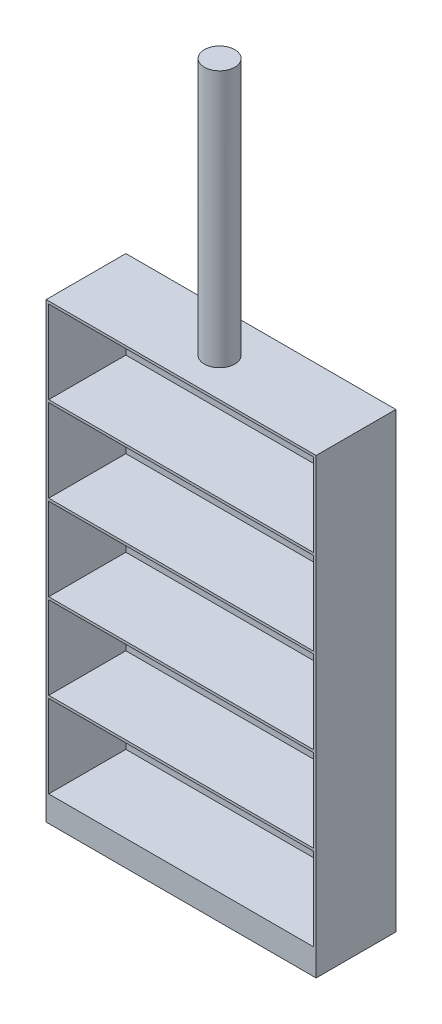
ISO-10303-21;
HEADER;
FILE_DESCRIPTION(('STEP AP214'),'2;1');
FILE_NAME('part.step','',(''),(''),'','','');
FILE_SCHEMA(('AUTOMOTIVE_DESIGN { 1 0 10303 214 1 1 1 1 }'));
ENDSEC;
DATA;
#1=APPLICATION_CONTEXT('core data for automotive mechanical design processes');
#2=APPLICATION_PROTOCOL_DEFINITION('international standard','automotive_design',2000,#1);
#3=PRODUCT_CONTEXT('',#1,'mechanical');
#4=PRODUCT('Part','Part','',(#3));
#5=PRODUCT_RELATED_PRODUCT_CATEGORY('part','',(#4));
#6=PRODUCT_DEFINITION_FORMATION('','',#4);
#7=PRODUCT_DEFINITION_CONTEXT('part definition',#1,'design');
#8=PRODUCT_DEFINITION('design','',#6,#7);
#9=PRODUCT_DEFINITION_SHAPE('','',#8);
#10=(LENGTH_UNIT() NAMED_UNIT(*) SI_UNIT(.MILLI.,.METRE.));
#11=(NAMED_UNIT(*) PLANE_ANGLE_UNIT() SI_UNIT($,.RADIAN.));
#12=(NAMED_UNIT(*) SI_UNIT($,.STERADIAN.) SOLID_ANGLE_UNIT());
#13=UNCERTAINTY_MEASURE_WITH_UNIT(LENGTH_MEASURE(1.E-05),#10,'distance_accuracy_value','');
#14=(GEOMETRIC_REPRESENTATION_CONTEXT(3) GLOBAL_UNCERTAINTY_ASSIGNED_CONTEXT((#13)) GLOBAL_UNIT_ASSIGNED_CONTEXT((#10,
#11,#12)) REPRESENTATION_CONTEXT('',''));
#15=CARTESIAN_POINT('',(0.,0.,0.));
#16=DIRECTION('',(0.,0.,1.));
#17=DIRECTION('',(1.,0.,0.));
#18=AXIS2_PLACEMENT_3D('',#15,#16,#17);
#19=CARTESIAN_POINT('',(-525.,880.,10.));
#20=DIRECTION('',(0.,-1.,0.));
#21=DIRECTION('',(0.,0.,-1.));
#22=AXIS2_PLACEMENT_3D('',#19,#20,#21);
#23=PLANE('',#22);
#24=DIRECTION('',(-1.,0.,0.));
#25=VECTOR('',#24,1.);
#26=CARTESIAN_POINT('',(-525.,880.,0.));
#27=LINE('',#26,#25);
#28=CARTESIAN_POINT('',(525.,880.,0.));
#29=VERTEX_POINT('',#28);
#30=CARTESIAN_POINT('',(-525.,880.,0.));
#31=VERTEX_POINT('',#30);
#32=EDGE_CURVE('E373',#29,#31,#27,.T.);
#33=ORIENTED_EDGE('',*,*,#32,.T.);
#34=DIRECTION('',(0.,0.,-1.));
#35=VECTOR('',#34,1.);
#36=CARTESIAN_POINT('',(-525.,880.,10.));
#37=LINE('',#36,#35);
#38=CARTESIAN_POINT('',(-525.,880.,310.));
#39=VERTEX_POINT('',#38);
#40=EDGE_CURVE('E385',#39,#31,#37,.T.);
#41=ORIENTED_EDGE('',*,*,#40,.F.);
#42=DIRECTION('',(-1.,0.,0.));
#43=VECTOR('',#42,1.);
#44=CARTESIAN_POINT('',(-525.,880.,310.));
#45=LINE('',#44,#43);
#46=CARTESIAN_POINT('',(525.,880.,310.));
#47=VERTEX_POINT('',#46);
#48=EDGE_CURVE('E358',#47,#39,#45,.T.);
#49=ORIENTED_EDGE('',*,*,#48,.F.);
#50=DIRECTION('',(0.,0.,-1.));
#51=VECTOR('',#50,1.);
#52=CARTESIAN_POINT('',(525.,880.,10.));
#53=LINE('',#52,#51);
#54=EDGE_CURVE('E41',#47,#29,#53,.T.);
#55=ORIENTED_EDGE('',*,*,#54,.T.);
#56=EDGE_LOOP('',(#33,#41,#49,#55));
#57=FACE_BOUND('',#56,.T.);
#58=CARTESIAN_POINT('',(0.,880.,160.462668290165));
#59=DIRECTION('',(0.,-1.,0.));
#60=DIRECTION('',(0.,0.,-1.));
#61=AXIS2_PLACEMENT_3D('',#58,#59,#60);
#62=CIRCLE('',#61,59.2219947177455);
#63=CARTESIAN_POINT('',(0.,880.,101.24067357242));
#64=VERTEX_POINT('',#63);
#65=EDGE_CURVE('E11',#64,#64,#62,.F.);
#66=ORIENTED_EDGE('',*,*,#65,.F.);
#67=EDGE_LOOP('',(#66));
#68=FACE_BOUND('',#67,.T.);
#69=ADVANCED_FACE('F33',(#57,#68),#23,.F.);
#70=CARTESIAN_POINT('',(525.,-880.,10.));
#71=DIRECTION('',(-1.,0.,0.));
#72=DIRECTION('',(0.,0.,1.));
#73=AXIS2_PLACEMENT_3D('',#70,#71,#72);
#74=PLANE('',#73);
#75=DIRECTION('',(0.,1.,0.));
#76=VECTOR('',#75,1.);
#77=CARTESIAN_POINT('',(525.,-880.,0.));
#78=LINE('',#77,#76);
#79=CARTESIAN_POINT('',(525.,-880.,0.));
#80=VERTEX_POINT('',#79);
#81=EDGE_CURVE('E370',#80,#29,#78,.T.);
#82=ORIENTED_EDGE('',*,*,#81,.T.);
#83=ORIENTED_EDGE('',*,*,#54,.F.);
#84=DIRECTION('',(0.,1.,0.));
#85=VECTOR('',#84,1.);
#86=CARTESIAN_POINT('',(525.,880.,310.));
#87=LINE('',#86,#85);
#88=CARTESIAN_POINT('',(525.,-880.,310.));
#89=VERTEX_POINT('',#88);
#90=EDGE_CURVE('E367',#89,#47,#87,.T.);
#91=ORIENTED_EDGE('',*,*,#90,.F.);
#92=DIRECTION('',(0.,0.,-1.));
#93=VECTOR('',#92,1.);
#94=CARTESIAN_POINT('',(525.,-880.,10.));
#95=LINE('',#94,#93);
#96=EDGE_CURVE('E379',#89,#80,#95,.T.);
#97=ORIENTED_EDGE('',*,*,#96,.T.);
#98=EDGE_LOOP('',(#82,#83,#91,#97));
#99=FACE_BOUND('',#98,.T.);
#100=ADVANCED_FACE('F35',(#99),#74,.F.);
#101=CARTESIAN_POINT('',(-525.,-880.,10.));
#102=DIRECTION('',(1.,0.,0.));
#103=DIRECTION('',(0.,0.,-1.));
#104=AXIS2_PLACEMENT_3D('',#101,#102,#103);
#105=PLANE('',#104);
#106=DIRECTION('',(0.,-1.,0.));
#107=VECTOR('',#106,1.);
#108=CARTESIAN_POINT('',(-525.,-880.,0.));
#109=LINE('',#108,#107);
#110=CARTESIAN_POINT('',(-525.,-880.,0.));
#111=VERTEX_POINT('',#110);
#112=EDGE_CURVE('E375',#31,#111,#109,.T.);
#113=ORIENTED_EDGE('',*,*,#112,.T.);
#114=DIRECTION('',(0.,0.,-1.));
#115=VECTOR('',#114,1.);
#116=CARTESIAN_POINT('',(-525.,-880.,10.));
#117=LINE('',#116,#115);
#118=CARTESIAN_POINT('',(-525.,-880.,310.));
#119=VERTEX_POINT('',#118);
#120=EDGE_CURVE('E382',#119,#111,#117,.T.);
#121=ORIENTED_EDGE('',*,*,#120,.F.);
#122=DIRECTION('',(0.,-1.,0.));
#123=VECTOR('',#122,1.);
#124=CARTESIAN_POINT('',(-525.,-880.,310.));
#125=LINE('',#124,#123);
#126=EDGE_CURVE('E361',#39,#119,#125,.T.);
#127=ORIENTED_EDGE('',*,*,#126,.F.);
#128=ORIENTED_EDGE('',*,*,#40,.T.);
#129=EDGE_LOOP('',(#113,#121,#127,#128));
#130=FACE_BOUND('',#129,.T.);
#131=ADVANCED_FACE('F399',(#130),#105,.F.);
#132=CARTESIAN_POINT('',(-525.,-880.,10.));
#133=DIRECTION('',(0.,1.,0.));
#134=DIRECTION('',(0.,0.,1.));
#135=AXIS2_PLACEMENT_3D('',#132,#133,#134);
#136=PLANE('',#135);
#137=DIRECTION('',(1.,0.,0.));
#138=VECTOR('',#137,1.);
#139=CARTESIAN_POINT('',(-525.,-880.,0.));
#140=LINE('',#139,#138);
#141=EDGE_CURVE('E377',#111,#80,#140,.T.);
#142=ORIENTED_EDGE('',*,*,#141,.T.);
#143=ORIENTED_EDGE('',*,*,#96,.F.);
#144=DIRECTION('',(1.,0.,0.));
#145=VECTOR('',#144,1.);
#146=CARTESIAN_POINT('',(525.,-880.,310.));
#147=LINE('',#146,#145);
#148=EDGE_CURVE('E364',#119,#89,#147,.T.);
#149=ORIENTED_EDGE('',*,*,#148,.F.);
#150=ORIENTED_EDGE('',*,*,#120,.T.);
#151=EDGE_LOOP('',(#142,#143,#149,#150));
#152=FACE_BOUND('',#151,.T.);
#153=ADVANCED_FACE('F403',(#152),#136,.F.);
#154=CARTESIAN_POINT('',(0.,0.,0.));
#155=DIRECTION('',(0.,0.,-1.));
#156=DIRECTION('',(-1.,0.,0.));
#157=AXIS2_PLACEMENT_3D('',#154,#155,#156);
#158=PLANE('',#157);
#159=ORIENTED_EDGE('',*,*,#81,.F.);
#160=ORIENTED_EDGE('',*,*,#141,.F.);
#161=ORIENTED_EDGE('',*,*,#112,.F.);
#162=ORIENTED_EDGE('',*,*,#32,.F.);
#163=EDGE_LOOP('',(#159,#160,#161,#162));
#164=FACE_BOUND('',#163,.T.);
#165=ADVANCED_FACE('F396',(#164),#158,.T.);
#166=CARTESIAN_POINT('',(0.,0.,310.));
#167=DIRECTION('',(0.,0.,-1.));
#168=DIRECTION('',(-1.,0.,0.));
#169=AXIS2_PLACEMENT_3D('',#166,#167,#168);
#170=PLANE('',#169);
#171=DIRECTION('',(0.,1.,0.));
#172=VECTOR('',#171,1.);
#173=CARTESIAN_POINT('',(515.,-448.,310.));
#174=LINE('',#173,#172);
#175=CARTESIAN_POINT('',(515.,-448.,310.));
#176=VERTEX_POINT('',#175);
#177=CARTESIAN_POINT('',(515.,-126.,310.));
#178=VERTEX_POINT('',#177);
#179=EDGE_CURVE('E241',#176,#178,#174,.T.);
#180=ORIENTED_EDGE('',*,*,#179,.F.);
#181=DIRECTION('',(1.,0.,0.));
#182=VECTOR('',#181,1.);
#183=CARTESIAN_POINT('',(515.,-448.,310.));
#184=LINE('',#183,#182);
#185=CARTESIAN_POINT('',(-515.,-448.,310.));
#186=VERTEX_POINT('',#185);
#187=EDGE_CURVE('E249',#186,#176,#184,.T.);
#188=ORIENTED_EDGE('',*,*,#187,.F.);
#189=DIRECTION('',(0.,-1.,0.));
#190=VECTOR('',#189,1.);
#191=CARTESIAN_POINT('',(-515.,-448.,310.));
#192=LINE('',#191,#190);
#193=CARTESIAN_POINT('',(-515.,-126.,310.));
#194=VERTEX_POINT('',#193);
#195=EDGE_CURVE('E246',#194,#186,#192,.T.);
#196=ORIENTED_EDGE('',*,*,#195,.F.);
#197=DIRECTION('',(-1.,0.,0.));
#198=VECTOR('',#197,1.);
#199=CARTESIAN_POINT('',(515.,-126.,310.));
#200=LINE('',#199,#198);
#201=EDGE_CURVE('E243',#178,#194,#200,.T.);
#202=ORIENTED_EDGE('',*,*,#201,.F.);
#203=EDGE_LOOP('',(#180,#188,#196,#202));
#204=FACE_BOUND('',#203,.T.);
#205=DIRECTION('',(0.,1.,0.));
#206=VECTOR('',#205,1.);
#207=CARTESIAN_POINT('',(515.,216.,310.));
#208=LINE('',#207,#206);
#209=CARTESIAN_POINT('',(515.,216.,310.));
#210=VERTEX_POINT('',#209);
#211=CARTESIAN_POINT('',(515.,538.,310.));
#212=VERTEX_POINT('',#211);
#213=EDGE_CURVE('E301',#210,#212,#208,.T.);
#214=ORIENTED_EDGE('',*,*,#213,.F.);
#215=DIRECTION('',(1.,0.,0.));
#216=VECTOR('',#215,1.);
#217=CARTESIAN_POINT('',(515.,216.,310.));
#218=LINE('',#217,#216);
#219=CARTESIAN_POINT('',(-515.,216.,310.));
#220=VERTEX_POINT('',#219);
#221=EDGE_CURVE('E309',#220,#210,#218,.T.);
#222=ORIENTED_EDGE('',*,*,#221,.F.);
#223=DIRECTION('',(0.,-1.,0.));
#224=VECTOR('',#223,1.);
#225=CARTESIAN_POINT('',(-515.,216.,310.));
#226=LINE('',#225,#224);
#227=CARTESIAN_POINT('',(-515.,538.,310.));
#228=VERTEX_POINT('',#227);
#229=EDGE_CURVE('E306',#228,#220,#226,.T.);
#230=ORIENTED_EDGE('',*,*,#229,.F.);
#231=DIRECTION('',(-1.,0.,0.));
#232=VECTOR('',#231,1.);
#233=CARTESIAN_POINT('',(515.,538.,310.));
#234=LINE('',#233,#232);
#235=EDGE_CURVE('E303',#212,#228,#234,.T.);
#236=ORIENTED_EDGE('',*,*,#235,.F.);
#237=EDGE_LOOP('',(#214,#222,#230,#236));
#238=FACE_BOUND('',#237,.T.);
#239=ORIENTED_EDGE('',*,*,#48,.T.);
#240=ORIENTED_EDGE('',*,*,#126,.T.);
#241=ORIENTED_EDGE('',*,*,#148,.T.);
#242=ORIENTED_EDGE('',*,*,#90,.T.);
#243=EDGE_LOOP('',(#239,#240,#241,#242));
#244=FACE_BOUND('',#243,.T.);
#245=DIRECTION('',(0.,1.,0.));
#246=VECTOR('',#245,1.);
#247=CARTESIAN_POINT('',(515.,548.,310.));
#248=LINE('',#247,#246);
#249=CARTESIAN_POINT('',(515.,548.,310.));
#250=VERTEX_POINT('',#249);
#251=CARTESIAN_POINT('',(515.,870.,310.));
#252=VERTEX_POINT('',#251);
#253=EDGE_CURVE('E330',#250,#252,#248,.T.);
#254=ORIENTED_EDGE('',*,*,#253,.F.);
#255=DIRECTION('',(1.,0.,0.));
#256=VECTOR('',#255,1.);
#257=CARTESIAN_POINT('',(515.,548.,310.));
#258=LINE('',#257,#256);
#259=CARTESIAN_POINT('',(-515.,548.,310.));
#260=VERTEX_POINT('',#259);
#261=EDGE_CURVE('E338',#260,#250,#258,.T.);
#262=ORIENTED_EDGE('',*,*,#261,.F.);
#263=DIRECTION('',(0.,-1.,0.));
#264=VECTOR('',#263,1.);
#265=CARTESIAN_POINT('',(-515.,548.,310.));
#266=LINE('',#265,#264);
#267=CARTESIAN_POINT('',(-515.,870.,310.));
#268=VERTEX_POINT('',#267);
#269=EDGE_CURVE('E335',#268,#260,#266,.T.);
#270=ORIENTED_EDGE('',*,*,#269,.F.);
#271=DIRECTION('',(-1.,0.,0.));
#272=VECTOR('',#271,1.);
#273=CARTESIAN_POINT('',(515.,870.,310.));
#274=LINE('',#273,#272);
#275=EDGE_CURVE('E332',#252,#268,#274,.T.);
#276=ORIENTED_EDGE('',*,*,#275,.F.);
#277=EDGE_LOOP('',(#254,#262,#270,#276));
#278=FACE_BOUND('',#277,.T.);
#279=DIRECTION('',(0.,1.,0.));
#280=VECTOR('',#279,1.);
#281=CARTESIAN_POINT('',(515.,-116.,310.));
#282=LINE('',#281,#280);
#283=CARTESIAN_POINT('',(515.,-116.,310.));
#284=VERTEX_POINT('',#283);
#285=CARTESIAN_POINT('',(515.,206.,310.));
#286=VERTEX_POINT('',#285);
#287=EDGE_CURVE('E271',#284,#286,#282,.T.);
#288=ORIENTED_EDGE('',*,*,#287,.F.);
#289=DIRECTION('',(1.,0.,0.));
#290=VECTOR('',#289,1.);
#291=CARTESIAN_POINT('',(515.,-116.,310.));
#292=LINE('',#291,#290);
#293=CARTESIAN_POINT('',(-515.,-116.,310.));
#294=VERTEX_POINT('',#293);
#295=EDGE_CURVE('E279',#294,#284,#292,.T.);
#296=ORIENTED_EDGE('',*,*,#295,.F.);
#297=DIRECTION('',(0.,-1.,0.));
#298=VECTOR('',#297,1.);
#299=CARTESIAN_POINT('',(-515.,-116.,310.));
#300=LINE('',#299,#298);
#301=CARTESIAN_POINT('',(-515.,206.,310.));
#302=VERTEX_POINT('',#301);
#303=EDGE_CURVE('E276',#302,#294,#300,.T.);
#304=ORIENTED_EDGE('',*,*,#303,.F.);
#305=DIRECTION('',(-1.,0.,0.));
#306=VECTOR('',#305,1.);
#307=CARTESIAN_POINT('',(515.,206.,310.));
#308=LINE('',#307,#306);
#309=EDGE_CURVE('E273',#286,#302,#308,.T.);
#310=ORIENTED_EDGE('',*,*,#309,.F.);
#311=EDGE_LOOP('',(#288,#296,#304,#310));
#312=FACE_BOUND('',#311,.T.);
#313=DIRECTION('',(0.,1.,0.));
#314=VECTOR('',#313,1.);
#315=CARTESIAN_POINT('',(515.,-780.,310.));
#316=LINE('',#315,#314);
#317=CARTESIAN_POINT('',(515.,-780.,310.));
#318=VERTEX_POINT('',#317);
#319=CARTESIAN_POINT('',(515.,-458.,310.));
#320=VERTEX_POINT('',#319);
#321=EDGE_CURVE('E197',#318,#320,#316,.T.);
#322=ORIENTED_EDGE('',*,*,#321,.F.);
#323=DIRECTION('',(1.,0.,0.));
#324=VECTOR('',#323,1.);
#325=CARTESIAN_POINT('',(515.,-780.,310.));
#326=LINE('',#325,#324);
#327=CARTESIAN_POINT('',(-515.,-780.,310.));
#328=VERTEX_POINT('',#327);
#329=EDGE_CURVE('E223',#328,#318,#326,.T.);
#330=ORIENTED_EDGE('',*,*,#329,.F.);
#331=DIRECTION('',(0.,-1.,0.));
#332=VECTOR('',#331,1.);
#333=CARTESIAN_POINT('',(-515.,-780.,310.));
#334=LINE('',#333,#332);
#335=CARTESIAN_POINT('',(-515.,-458.,310.));
#336=VERTEX_POINT('',#335);
#337=EDGE_CURVE('E221',#336,#328,#334,.T.);
#338=ORIENTED_EDGE('',*,*,#337,.F.);
#339=DIRECTION('',(-1.,0.,0.));
#340=VECTOR('',#339,1.);
#341=CARTESIAN_POINT('',(515.,-458.,310.));
#342=LINE('',#341,#340);
#343=EDGE_CURVE('E207',#320,#336,#342,.T.);
#344=ORIENTED_EDGE('',*,*,#343,.F.);
#345=EDGE_LOOP('',(#322,#330,#338,#344));
#346=FACE_BOUND('',#345,.T.);
#347=ADVANCED_FACE('F219',(#204,#238,#244,#278,#312,#346),#170,.F.);
#348=CARTESIAN_POINT('',(515.,548.,310.));
#349=DIRECTION('',(-1.,0.,0.));
#350=DIRECTION('',(0.,0.,1.));
#351=AXIS2_PLACEMENT_3D('',#348,#349,#350);
#352=PLANE('',#351);
#353=DIRECTION('',(0.,1.,0.));
#354=VECTOR('',#353,1.);
#355=CARTESIAN_POINT('',(515.,548.,10.));
#356=LINE('',#355,#354);
#357=CARTESIAN_POINT('',(515.,548.,10.));
#358=VERTEX_POINT('',#357);
#359=CARTESIAN_POINT('',(515.,870.,10.));
#360=VERTEX_POINT('',#359);
#361=EDGE_CURVE('E329',#358,#360,#356,.T.);
#362=ORIENTED_EDGE('',*,*,#361,.F.);
#363=DIRECTION('',(0.,0.,-1.));
#364=VECTOR('',#363,1.);
#365=CARTESIAN_POINT('',(515.,548.,310.));
#366=LINE('',#365,#364);
#367=EDGE_CURVE('E48',#250,#358,#366,.T.);
#368=ORIENTED_EDGE('',*,*,#367,.F.);
#369=ORIENTED_EDGE('',*,*,#253,.T.);
#370=DIRECTION('',(0.,0.,-1.));
#371=VECTOR('',#370,1.);
#372=CARTESIAN_POINT('',(515.,870.,310.));
#373=LINE('',#372,#371);
#374=EDGE_CURVE('E355',#252,#360,#373,.T.);
#375=ORIENTED_EDGE('',*,*,#374,.T.);
#376=EDGE_LOOP('',(#362,#368,#369,#375));
#377=FACE_BOUND('',#376,.T.);
#378=ADVANCED_FACE('F407',(#377),#352,.T.);
#379=CARTESIAN_POINT('',(515.,870.,310.));
#380=DIRECTION('',(0.,-1.,0.));
#381=DIRECTION('',(1.,0.,0.));
#382=AXIS2_PLACEMENT_3D('',#379,#380,#381);
#383=PLANE('',#382);
#384=DIRECTION('',(-1.,0.,0.));
#385=VECTOR('',#384,1.);
#386=CARTESIAN_POINT('',(515.,870.,10.));
#387=LINE('',#386,#385);
#388=CARTESIAN_POINT('',(-515.,870.,10.));
#389=VERTEX_POINT('',#388);
#390=EDGE_CURVE('E342',#360,#389,#387,.T.);
#391=ORIENTED_EDGE('',*,*,#390,.F.);
#392=ORIENTED_EDGE('',*,*,#374,.F.);
#393=ORIENTED_EDGE('',*,*,#275,.T.);
#394=DIRECTION('',(0.,0.,-1.));
#395=VECTOR('',#394,1.);
#396=CARTESIAN_POINT('',(-515.,870.,310.));
#397=LINE('',#396,#395);
#398=EDGE_CURVE('E353',#268,#389,#397,.T.);
#399=ORIENTED_EDGE('',*,*,#398,.T.);
#400=EDGE_LOOP('',(#391,#392,#393,#399));
#401=FACE_BOUND('',#400,.T.);
#402=ADVANCED_FACE('F465',(#401),#383,.T.);
#403=CARTESIAN_POINT('',(-515.,548.,310.));
#404=DIRECTION('',(1.,0.,0.));
#405=DIRECTION('',(0.,0.,-1.));
#406=AXIS2_PLACEMENT_3D('',#403,#404,#405);
#407=PLANE('',#406);
#408=DIRECTION('',(0.,-1.,0.));
#409=VECTOR('',#408,1.);
#410=CARTESIAN_POINT('',(-515.,548.,10.));
#411=LINE('',#410,#409);
#412=CARTESIAN_POINT('',(-515.,548.,10.));
#413=VERTEX_POINT('',#412);
#414=EDGE_CURVE('E345',#389,#413,#411,.T.);
#415=ORIENTED_EDGE('',*,*,#414,.F.);
#416=ORIENTED_EDGE('',*,*,#398,.F.);
#417=ORIENTED_EDGE('',*,*,#269,.T.);
#418=DIRECTION('',(0.,0.,-1.));
#419=VECTOR('',#418,1.);
#420=CARTESIAN_POINT('',(-515.,548.,310.));
#421=LINE('',#420,#419);
#422=EDGE_CURVE('E351',#260,#413,#421,.T.);
#423=ORIENTED_EDGE('',*,*,#422,.T.);
#424=EDGE_LOOP('',(#415,#416,#417,#423));
#425=FACE_BOUND('',#424,.T.);
#426=ADVANCED_FACE('F469',(#425),#407,.T.);
#427=CARTESIAN_POINT('',(515.,548.,310.));
#428=DIRECTION('',(0.,1.,0.));
#429=DIRECTION('',(0.,0.,1.));
#430=AXIS2_PLACEMENT_3D('',#427,#428,#429);
#431=PLANE('',#430);
#432=DIRECTION('',(1.,0.,0.));
#433=VECTOR('',#432,1.);
#434=CARTESIAN_POINT('',(515.,548.,10.));
#435=LINE('',#434,#433);
#436=EDGE_CURVE('E333',#413,#358,#435,.T.);
#437=ORIENTED_EDGE('',*,*,#436,.F.);
#438=ORIENTED_EDGE('',*,*,#422,.F.);
#439=ORIENTED_EDGE('',*,*,#261,.T.);
#440=ORIENTED_EDGE('',*,*,#367,.T.);
#441=EDGE_LOOP('',(#437,#438,#439,#440));
#442=FACE_BOUND('',#441,.T.);
#443=ADVANCED_FACE('F473',(#442),#431,.T.);
#444=CARTESIAN_POINT('',(515.,216.,310.));
#445=DIRECTION('',(-1.,0.,0.));
#446=DIRECTION('',(0.,0.,1.));
#447=AXIS2_PLACEMENT_3D('',#444,#445,#446);
#448=PLANE('',#447);
#449=DIRECTION('',(0.,1.,0.));
#450=VECTOR('',#449,1.);
#451=CARTESIAN_POINT('',(515.,216.,10.));
#452=LINE('',#451,#450);
#453=CARTESIAN_POINT('',(515.,216.,10.));
#454=VERTEX_POINT('',#453);
#455=CARTESIAN_POINT('',(515.,538.,10.));
#456=VERTEX_POINT('',#455);
#457=EDGE_CURVE('E300',#454,#456,#452,.T.);
#458=ORIENTED_EDGE('',*,*,#457,.F.);
#459=DIRECTION('',(0.,0.,-1.));
#460=VECTOR('',#459,1.);
#461=CARTESIAN_POINT('',(515.,216.,310.));
#462=LINE('',#461,#460);
#463=EDGE_CURVE('E56',#210,#454,#462,.T.);
#464=ORIENTED_EDGE('',*,*,#463,.F.);
#465=ORIENTED_EDGE('',*,*,#213,.T.);
#466=DIRECTION('',(0.,0.,-1.));
#467=VECTOR('',#466,1.);
#468=CARTESIAN_POINT('',(515.,538.,310.));
#469=LINE('',#468,#467);
#470=EDGE_CURVE('E326',#212,#456,#469,.T.);
#471=ORIENTED_EDGE('',*,*,#470,.T.);
#472=EDGE_LOOP('',(#458,#464,#465,#471));
#473=FACE_BOUND('',#472,.T.);
#474=ADVANCED_FACE('F477',(#473),#448,.T.);
#475=CARTESIAN_POINT('',(515.,538.,310.));
#476=DIRECTION('',(0.,-1.,0.));
#477=DIRECTION('',(0.,0.,-1.));
#478=AXIS2_PLACEMENT_3D('',#475,#476,#477);
#479=PLANE('',#478);
#480=DIRECTION('',(-1.,0.,0.));
#481=VECTOR('',#480,1.);
#482=CARTESIAN_POINT('',(515.,538.,10.));
#483=LINE('',#482,#481);
#484=CARTESIAN_POINT('',(-515.,538.,10.));
#485=VERTEX_POINT('',#484);
#486=EDGE_CURVE('E313',#456,#485,#483,.T.);
#487=ORIENTED_EDGE('',*,*,#486,.F.);
#488=ORIENTED_EDGE('',*,*,#470,.F.);
#489=ORIENTED_EDGE('',*,*,#235,.T.);
#490=DIRECTION('',(0.,0.,-1.));
#491=VECTOR('',#490,1.);
#492=CARTESIAN_POINT('',(-515.,538.,310.));
#493=LINE('',#492,#491);
#494=EDGE_CURVE('E324',#228,#485,#493,.T.);
#495=ORIENTED_EDGE('',*,*,#494,.T.);
#496=EDGE_LOOP('',(#487,#488,#489,#495));
#497=FACE_BOUND('',#496,.T.);
#498=ADVANCED_FACE('F480',(#497),#479,.T.);
#499=CARTESIAN_POINT('',(-515.,216.,310.));
#500=DIRECTION('',(1.,0.,0.));
#501=DIRECTION('',(0.,0.,-1.));
#502=AXIS2_PLACEMENT_3D('',#499,#500,#501);
#503=PLANE('',#502);
#504=DIRECTION('',(0.,-1.,0.));
#505=VECTOR('',#504,1.);
#506=CARTESIAN_POINT('',(-515.,216.,10.));
#507=LINE('',#506,#505);
#508=CARTESIAN_POINT('',(-515.,216.,10.));
#509=VERTEX_POINT('',#508);
#510=EDGE_CURVE('E316',#485,#509,#507,.T.);
#511=ORIENTED_EDGE('',*,*,#510,.F.);
#512=ORIENTED_EDGE('',*,*,#494,.F.);
#513=ORIENTED_EDGE('',*,*,#229,.T.);
#514=DIRECTION('',(0.,0.,-1.));
#515=VECTOR('',#514,1.);
#516=CARTESIAN_POINT('',(-515.,216.,310.));
#517=LINE('',#516,#515);
#518=EDGE_CURVE('E322',#220,#509,#517,.T.);
#519=ORIENTED_EDGE('',*,*,#518,.T.);
#520=EDGE_LOOP('',(#511,#512,#513,#519));
#521=FACE_BOUND('',#520,.T.);
#522=ADVANCED_FACE('F484',(#521),#503,.T.);
#523=CARTESIAN_POINT('',(515.,216.,310.));
#524=DIRECTION('',(0.,1.,0.));
#525=DIRECTION('',(0.,0.,1.));
#526=AXIS2_PLACEMENT_3D('',#523,#524,#525);
#527=PLANE('',#526);
#528=DIRECTION('',(1.,0.,0.));
#529=VECTOR('',#528,1.);
#530=CARTESIAN_POINT('',(515.,216.,10.));
#531=LINE('',#530,#529);
#532=EDGE_CURVE('E304',#509,#454,#531,.T.);
#533=ORIENTED_EDGE('',*,*,#532,.F.);
#534=ORIENTED_EDGE('',*,*,#518,.F.);
#535=ORIENTED_EDGE('',*,*,#221,.T.);
#536=ORIENTED_EDGE('',*,*,#463,.T.);
#537=EDGE_LOOP('',(#533,#534,#535,#536));
#538=FACE_BOUND('',#537,.T.);
#539=ADVANCED_FACE('F488',(#538),#527,.T.);
#540=CARTESIAN_POINT('',(515.,-116.,310.));
#541=DIRECTION('',(-1.,0.,0.));
#542=DIRECTION('',(0.,0.,1.));
#543=AXIS2_PLACEMENT_3D('',#540,#541,#542);
#544=PLANE('',#543);
#545=DIRECTION('',(0.,1.,0.));
#546=VECTOR('',#545,1.);
#547=CARTESIAN_POINT('',(515.,-116.,10.));
#548=LINE('',#547,#546);
#549=CARTESIAN_POINT('',(515.,-116.,10.));
#550=VERTEX_POINT('',#549);
#551=CARTESIAN_POINT('',(515.,206.,10.));
#552=VERTEX_POINT('',#551);
#553=EDGE_CURVE('E270',#550,#552,#548,.T.);
#554=ORIENTED_EDGE('',*,*,#553,.F.);
#555=DIRECTION('',(0.,0.,-1.));
#556=VECTOR('',#555,1.);
#557=CARTESIAN_POINT('',(515.,-116.,310.));
#558=LINE('',#557,#556);
#559=EDGE_CURVE('E281',#284,#550,#558,.T.);
#560=ORIENTED_EDGE('',*,*,#559,.F.);
#561=ORIENTED_EDGE('',*,*,#287,.T.);
#562=DIRECTION('',(0.,0.,-1.));
#563=VECTOR('',#562,1.);
#564=CARTESIAN_POINT('',(515.,206.,310.));
#565=LINE('',#564,#563);
#566=EDGE_CURVE('E297',#286,#552,#565,.T.);
#567=ORIENTED_EDGE('',*,*,#566,.T.);
#568=EDGE_LOOP('',(#554,#560,#561,#567));
#569=FACE_BOUND('',#568,.T.);
#570=ADVANCED_FACE('F422',(#569),#544,.T.);
#571=CARTESIAN_POINT('',(515.,206.,310.));
#572=DIRECTION('',(0.,-1.,0.));
#573=DIRECTION('',(0.,0.,-1.));
#574=AXIS2_PLACEMENT_3D('',#571,#572,#573);
#575=PLANE('',#574);
#576=DIRECTION('',(-1.,0.,0.));
#577=VECTOR('',#576,1.);
#578=CARTESIAN_POINT('',(515.,206.,10.));
#579=LINE('',#578,#577);
#580=CARTESIAN_POINT('',(-515.,206.,10.));
#581=VERTEX_POINT('',#580);
#582=EDGE_CURVE('E284',#552,#581,#579,.T.);
#583=ORIENTED_EDGE('',*,*,#582,.F.);
#584=ORIENTED_EDGE('',*,*,#566,.F.);
#585=ORIENTED_EDGE('',*,*,#309,.T.);
#586=DIRECTION('',(0.,0.,-1.));
#587=VECTOR('',#586,1.);
#588=CARTESIAN_POINT('',(-515.,206.,310.));
#589=LINE('',#588,#587);
#590=EDGE_CURVE('E295',#302,#581,#589,.T.);
#591=ORIENTED_EDGE('',*,*,#590,.T.);
#592=EDGE_LOOP('',(#583,#584,#585,#591));
#593=FACE_BOUND('',#592,.T.);
#594=ADVANCED_FACE('F424',(#593),#575,.T.);
#595=CARTESIAN_POINT('',(-515.,-116.,310.));
#596=DIRECTION('',(1.,0.,0.));
#597=DIRECTION('',(0.,0.,-1.));
#598=AXIS2_PLACEMENT_3D('',#595,#596,#597);
#599=PLANE('',#598);
#600=DIRECTION('',(0.,-1.,0.));
#601=VECTOR('',#600,1.);
#602=CARTESIAN_POINT('',(-515.,-116.,10.));
#603=LINE('',#602,#601);
#604=CARTESIAN_POINT('',(-515.,-116.,10.));
#605=VERTEX_POINT('',#604);
#606=EDGE_CURVE('E287',#581,#605,#603,.T.);
#607=ORIENTED_EDGE('',*,*,#606,.F.);
#608=ORIENTED_EDGE('',*,*,#590,.F.);
#609=ORIENTED_EDGE('',*,*,#303,.T.);
#610=DIRECTION('',(0.,0.,-1.));
#611=VECTOR('',#610,1.);
#612=CARTESIAN_POINT('',(-515.,-116.,310.));
#613=LINE('',#612,#611);
#614=EDGE_CURVE('E293',#294,#605,#613,.T.);
#615=ORIENTED_EDGE('',*,*,#614,.T.);
#616=EDGE_LOOP('',(#607,#608,#609,#615));
#617=FACE_BOUND('',#616,.T.);
#618=ADVANCED_FACE('F433',(#617),#599,.T.);
#619=CARTESIAN_POINT('',(515.,-116.,310.));
#620=DIRECTION('',(0.,1.,0.));
#621=DIRECTION('',(0.,0.,1.));
#622=AXIS2_PLACEMENT_3D('',#619,#620,#621);
#623=PLANE('',#622);
#624=DIRECTION('',(1.,0.,0.));
#625=VECTOR('',#624,1.);
#626=CARTESIAN_POINT('',(515.,-116.,10.));
#627=LINE('',#626,#625);
#628=EDGE_CURVE('E274',#605,#550,#627,.T.);
#629=ORIENTED_EDGE('',*,*,#628,.F.);
#630=ORIENTED_EDGE('',*,*,#614,.F.);
#631=ORIENTED_EDGE('',*,*,#295,.T.);
#632=ORIENTED_EDGE('',*,*,#559,.T.);
#633=EDGE_LOOP('',(#629,#630,#631,#632));
#634=FACE_BOUND('',#633,.T.);
#635=ADVANCED_FACE('F431',(#634),#623,.T.);
#636=CARTESIAN_POINT('',(515.,-448.,310.));
#637=DIRECTION('',(-1.,0.,0.));
#638=DIRECTION('',(0.,0.,1.));
#639=AXIS2_PLACEMENT_3D('',#636,#637,#638);
#640=PLANE('',#639);
#641=DIRECTION('',(0.,1.,0.));
#642=VECTOR('',#641,1.);
#643=CARTESIAN_POINT('',(515.,-448.,10.));
#644=LINE('',#643,#642);
#645=CARTESIAN_POINT('',(515.,-448.,10.));
#646=VERTEX_POINT('',#645);
#647=CARTESIAN_POINT('',(515.,-126.,10.));
#648=VERTEX_POINT('',#647);
#649=EDGE_CURVE('E215',#646,#648,#644,.T.);
#650=ORIENTED_EDGE('',*,*,#649,.F.);
#651=DIRECTION('',(0.,0.,-1.));
#652=VECTOR('',#651,1.);
#653=CARTESIAN_POINT('',(515.,-448.,310.));
#654=LINE('',#653,#652);
#655=EDGE_CURVE('E251',#176,#646,#654,.T.);
#656=ORIENTED_EDGE('',*,*,#655,.F.);
#657=ORIENTED_EDGE('',*,*,#179,.T.);
#658=DIRECTION('',(0.,0.,-1.));
#659=VECTOR('',#658,1.);
#660=CARTESIAN_POINT('',(515.,-126.,310.));
#661=LINE('',#660,#659);
#662=EDGE_CURVE('E267',#178,#648,#661,.T.);
#663=ORIENTED_EDGE('',*,*,#662,.T.);
#664=EDGE_LOOP('',(#650,#656,#657,#663));
#665=FACE_BOUND('',#664,.T.);
#666=ADVANCED_FACE('F440',(#665),#640,.T.);
#667=CARTESIAN_POINT('',(515.,-126.,310.));
#668=DIRECTION('',(0.,-1.,0.));
#669=DIRECTION('',(0.,0.,-1.));
#670=AXIS2_PLACEMENT_3D('',#667,#668,#669);
#671=PLANE('',#670);
#672=DIRECTION('',(-1.,0.,0.));
#673=VECTOR('',#672,1.);
#674=CARTESIAN_POINT('',(515.,-126.,10.));
#675=LINE('',#674,#673);
#676=CARTESIAN_POINT('',(-515.,-126.,10.));
#677=VERTEX_POINT('',#676);
#678=EDGE_CURVE('E254',#648,#677,#675,.T.);
#679=ORIENTED_EDGE('',*,*,#678,.F.);
#680=ORIENTED_EDGE('',*,*,#662,.F.);
#681=ORIENTED_EDGE('',*,*,#201,.T.);
#682=DIRECTION('',(0.,0.,-1.));
#683=VECTOR('',#682,1.);
#684=CARTESIAN_POINT('',(-515.,-126.,310.));
#685=LINE('',#684,#683);
#686=EDGE_CURVE('E265',#194,#677,#685,.T.);
#687=ORIENTED_EDGE('',*,*,#686,.T.);
#688=EDGE_LOOP('',(#679,#680,#681,#687));
#689=FACE_BOUND('',#688,.T.);
#690=ADVANCED_FACE('F520',(#689),#671,.T.);
#691=CARTESIAN_POINT('',(-515.,-448.,310.));
#692=DIRECTION('',(1.,0.,0.));
#693=DIRECTION('',(0.,0.,-1.));
#694=AXIS2_PLACEMENT_3D('',#691,#692,#693);
#695=PLANE('',#694);
#696=DIRECTION('',(0.,-1.,0.));
#697=VECTOR('',#696,1.);
#698=CARTESIAN_POINT('',(-515.,-448.,10.));
#699=LINE('',#698,#697);
#700=CARTESIAN_POINT('',(-515.,-448.,10.));
#701=VERTEX_POINT('',#700);
#702=EDGE_CURVE('E257',#677,#701,#699,.T.);
#703=ORIENTED_EDGE('',*,*,#702,.F.);
#704=ORIENTED_EDGE('',*,*,#686,.F.);
#705=ORIENTED_EDGE('',*,*,#195,.T.);
#706=DIRECTION('',(0.,0.,-1.));
#707=VECTOR('',#706,1.);
#708=CARTESIAN_POINT('',(-515.,-448.,310.));
#709=LINE('',#708,#707);
#710=EDGE_CURVE('E263',#186,#701,#709,.T.);
#711=ORIENTED_EDGE('',*,*,#710,.T.);
#712=EDGE_LOOP('',(#703,#704,#705,#711));
#713=FACE_BOUND('',#712,.T.);
#714=ADVANCED_FACE('F530',(#713),#695,.T.);
#715=CARTESIAN_POINT('',(515.,-448.,310.));
#716=DIRECTION('',(0.,1.,0.));
#717=DIRECTION('',(0.,0.,1.));
#718=AXIS2_PLACEMENT_3D('',#715,#716,#717);
#719=PLANE('',#718);
#720=DIRECTION('',(1.,0.,0.));
#721=VECTOR('',#720,1.);
#722=CARTESIAN_POINT('',(515.,-448.,10.));
#723=LINE('',#722,#721);
#724=EDGE_CURVE('E244',#701,#646,#723,.T.);
#725=ORIENTED_EDGE('',*,*,#724,.F.);
#726=ORIENTED_EDGE('',*,*,#710,.F.);
#727=ORIENTED_EDGE('',*,*,#187,.T.);
#728=ORIENTED_EDGE('',*,*,#655,.T.);
#729=EDGE_LOOP('',(#725,#726,#727,#728));
#730=FACE_BOUND('',#729,.T.);
#731=ADVANCED_FACE('F540',(#730),#719,.T.);
#732=CARTESIAN_POINT('',(515.,-780.,310.));
#733=DIRECTION('',(-1.,0.,0.));
#734=DIRECTION('',(0.,0.,1.));
#735=AXIS2_PLACEMENT_3D('',#732,#733,#734);
#736=PLANE('',#735);
#737=DIRECTION('',(0.,1.,0.));
#738=VECTOR('',#737,1.);
#739=CARTESIAN_POINT('',(515.,-780.,10.));
#740=LINE('',#739,#738);
#741=CARTESIAN_POINT('',(515.,-780.,10.));
#742=VERTEX_POINT('',#741);
#743=CARTESIAN_POINT('',(515.,-458.,10.));
#744=VERTEX_POINT('',#743);
#745=EDGE_CURVE('E228',#742,#744,#740,.T.);
#746=ORIENTED_EDGE('',*,*,#745,.F.);
#747=DIRECTION('',(0.,0.,-1.));
#748=VECTOR('',#747,1.);
#749=CARTESIAN_POINT('',(515.,-780.,310.));
#750=LINE('',#749,#748);
#751=EDGE_CURVE('E203',#318,#742,#750,.T.);
#752=ORIENTED_EDGE('',*,*,#751,.F.);
#753=ORIENTED_EDGE('',*,*,#321,.T.);
#754=DIRECTION('',(0.,0.,-1.));
#755=VECTOR('',#754,1.);
#756=CARTESIAN_POINT('',(515.,-458.,310.));
#757=LINE('',#756,#755);
#758=EDGE_CURVE('E201',#320,#744,#757,.T.);
#759=ORIENTED_EDGE('',*,*,#758,.T.);
#760=EDGE_LOOP('',(#746,#752,#753,#759));
#761=FACE_BOUND('',#760,.T.);
#762=ADVANCED_FACE('F200',(#761),#736,.T.);
#763=CARTESIAN_POINT('',(515.,-458.,310.));
#764=DIRECTION('',(0.,-1.,0.));
#765=DIRECTION('',(0.,0.,-1.));
#766=AXIS2_PLACEMENT_3D('',#763,#764,#765);
#767=PLANE('',#766);
#768=DIRECTION('',(-1.,0.,0.));
#769=VECTOR('',#768,1.);
#770=CARTESIAN_POINT('',(515.,-458.,10.));
#771=LINE('',#770,#769);
#772=CARTESIAN_POINT('',(-515.,-458.,10.));
#773=VERTEX_POINT('',#772);
#774=EDGE_CURVE('E214',#744,#773,#771,.T.);
#775=ORIENTED_EDGE('',*,*,#774,.F.);
#776=ORIENTED_EDGE('',*,*,#758,.F.);
#777=ORIENTED_EDGE('',*,*,#343,.T.);
#778=DIRECTION('',(0.,0.,-1.));
#779=VECTOR('',#778,1.);
#780=CARTESIAN_POINT('',(-515.,-458.,310.));
#781=LINE('',#780,#779);
#782=EDGE_CURVE('E216',#336,#773,#781,.T.);
#783=ORIENTED_EDGE('',*,*,#782,.T.);
#784=EDGE_LOOP('',(#775,#776,#777,#783));
#785=FACE_BOUND('',#784,.T.);
#786=ADVANCED_FACE('F211',(#785),#767,.T.);
#787=CARTESIAN_POINT('',(-515.,-780.,310.));
#788=DIRECTION('',(1.,0.,0.));
#789=DIRECTION('',(0.,0.,-1.));
#790=AXIS2_PLACEMENT_3D('',#787,#788,#789);
#791=PLANE('',#790);
#792=DIRECTION('',(0.,-1.,0.));
#793=VECTOR('',#792,1.);
#794=CARTESIAN_POINT('',(-515.,-780.,10.));
#795=LINE('',#794,#793);
#796=CARTESIAN_POINT('',(-515.,-780.,10.));
#797=VERTEX_POINT('',#796);
#798=EDGE_CURVE('E232',#773,#797,#795,.T.);
#799=ORIENTED_EDGE('',*,*,#798,.F.);
#800=ORIENTED_EDGE('',*,*,#782,.F.);
#801=ORIENTED_EDGE('',*,*,#337,.T.);
#802=DIRECTION('',(0.,0.,-1.));
#803=VECTOR('',#802,1.);
#804=CARTESIAN_POINT('',(-515.,-780.,310.));
#805=LINE('',#804,#803);
#806=EDGE_CURVE('E238',#328,#797,#805,.T.);
#807=ORIENTED_EDGE('',*,*,#806,.T.);
#808=EDGE_LOOP('',(#799,#800,#801,#807));
#809=FACE_BOUND('',#808,.T.);
#810=ADVANCED_FACE('F567',(#809),#791,.T.);
#811=CARTESIAN_POINT('',(515.,-780.,310.));
#812=DIRECTION('',(0.,1.,0.));
#813=DIRECTION('',(0.,0.,1.));
#814=AXIS2_PLACEMENT_3D('',#811,#812,#813);
#815=PLANE('',#814);
#816=DIRECTION('',(1.,0.,0.));
#817=VECTOR('',#816,1.);
#818=CARTESIAN_POINT('',(515.,-780.,10.));
#819=LINE('',#818,#817);
#820=EDGE_CURVE('E208',#797,#742,#819,.T.);
#821=ORIENTED_EDGE('',*,*,#820,.F.);
#822=ORIENTED_EDGE('',*,*,#806,.F.);
#823=ORIENTED_EDGE('',*,*,#329,.T.);
#824=ORIENTED_EDGE('',*,*,#751,.T.);
#825=EDGE_LOOP('',(#821,#822,#823,#824));
#826=FACE_BOUND('',#825,.T.);
#827=ADVANCED_FACE('F576',(#826),#815,.T.);
#828=CARTESIAN_POINT('',(0.,0.,10.));
#829=DIRECTION('',(0.,0.,-1.));
#830=DIRECTION('',(-1.,0.,0.));
#831=AXIS2_PLACEMENT_3D('',#828,#829,#830);
#832=PLANE('',#831);
#833=ORIENTED_EDGE('',*,*,#724,.T.);
#834=ORIENTED_EDGE('',*,*,#649,.T.);
#835=ORIENTED_EDGE('',*,*,#678,.T.);
#836=ORIENTED_EDGE('',*,*,#702,.T.);
#837=EDGE_LOOP('',(#833,#834,#835,#836));
#838=FACE_BOUND('',#837,.T.);
#839=ADVANCED_FACE('F461',(#838),#832,.F.);
#840=ORIENTED_EDGE('',*,*,#628,.T.);
#841=ORIENTED_EDGE('',*,*,#553,.T.);
#842=ORIENTED_EDGE('',*,*,#582,.T.);
#843=ORIENTED_EDGE('',*,*,#606,.T.);
#844=EDGE_LOOP('',(#840,#841,#842,#843));
#845=FACE_BOUND('',#844,.T.);
#846=ADVANCED_FACE('F428',(#845),#832,.F.);
#847=ORIENTED_EDGE('',*,*,#532,.T.);
#848=ORIENTED_EDGE('',*,*,#457,.T.);
#849=ORIENTED_EDGE('',*,*,#486,.T.);
#850=ORIENTED_EDGE('',*,*,#510,.T.);
#851=EDGE_LOOP('',(#847,#848,#849,#850));
#852=FACE_BOUND('',#851,.T.);
#853=ADVANCED_FACE('F605',(#852),#832,.F.);
#854=ORIENTED_EDGE('',*,*,#436,.T.);
#855=ORIENTED_EDGE('',*,*,#361,.T.);
#856=ORIENTED_EDGE('',*,*,#390,.T.);
#857=ORIENTED_EDGE('',*,*,#414,.T.);
#858=EDGE_LOOP('',(#854,#855,#856,#857));
#859=FACE_BOUND('',#858,.T.);
#860=ADVANCED_FACE('F459',(#859),#832,.F.);
#861=ORIENTED_EDGE('',*,*,#820,.T.);
#862=ORIENTED_EDGE('',*,*,#745,.T.);
#863=ORIENTED_EDGE('',*,*,#774,.T.);
#864=ORIENTED_EDGE('',*,*,#798,.T.);
#865=EDGE_LOOP('',(#861,#862,#863,#864));
#866=FACE_BOUND('',#865,.T.);
#867=ADVANCED_FACE('F456',(#866),#832,.F.);
#868=CARTESIAN_POINT('',(0.,1880.,160.462668290165));
#869=DIRECTION('',(0.,-1.,0.));
#870=DIRECTION('',(0.,0.,-1.));
#871=AXIS2_PLACEMENT_3D('',#868,#869,#870);
#872=CYLINDRICAL_SURFACE('',#871,59.2219947177455);
#873=CARTESIAN_POINT('',(0.,1880.,160.462668290165));
#874=DIRECTION('',(0.,1.,0.));
#875=DIRECTION('',(0.,0.,1.));
#876=AXIS2_PLACEMENT_3D('',#873,#874,#875);
#877=CIRCLE('',#876,59.2219947177455);
#878=CARTESIAN_POINT('',(0.,1880.,219.684663007911));
#879=VERTEX_POINT('',#878);
#880=EDGE_CURVE('E230',#879,#879,#877,.T.);
#881=ORIENTED_EDGE('',*,*,#880,.F.);
#882=EDGE_LOOP('',(#881));
#883=FACE_BOUND('',#882,.T.);
#884=ORIENTED_EDGE('',*,*,#65,.T.);
#885=EDGE_LOOP('',(#884));
#886=FACE_BOUND('',#885,.T.);
#887=ADVANCED_FACE('F458',(#883,#886),#872,.T.);
#888=CARTESIAN_POINT('',(0.,1880.,160.462668290165));
#889=DIRECTION('',(0.,1.,0.));
#890=DIRECTION('',(0.,0.,1.));
#891=AXIS2_PLACEMENT_3D('',#888,#889,#890);
#892=PLANE('',#891);
#893=ORIENTED_EDGE('',*,*,#880,.T.);
#894=EDGE_LOOP('',(#893));
#895=FACE_BOUND('',#894,.T.);
#896=ADVANCED_FACE('F638',(#895),#892,.T.);
#897=CLOSED_SHELL('',(#69,#100,#131,#153,#165,#347,#378,#402,#426,#443,#474,#498,#522,#539,#570,
#594,#618,#635,#666,#690,#714,#731,#762,#786,#810,#827,#839,#846,#853,#860,#867,#887,#896));
#898=MANIFOLD_SOLID_BREP('B2',#897);
#899=ADVANCED_BREP_SHAPE_REPRESENTATION('',(#18,#898),#14);
#900=SHAPE_DEFINITION_REPRESENTATION(#9,#899);
ENDSEC;
END-ISO-10303-21;
